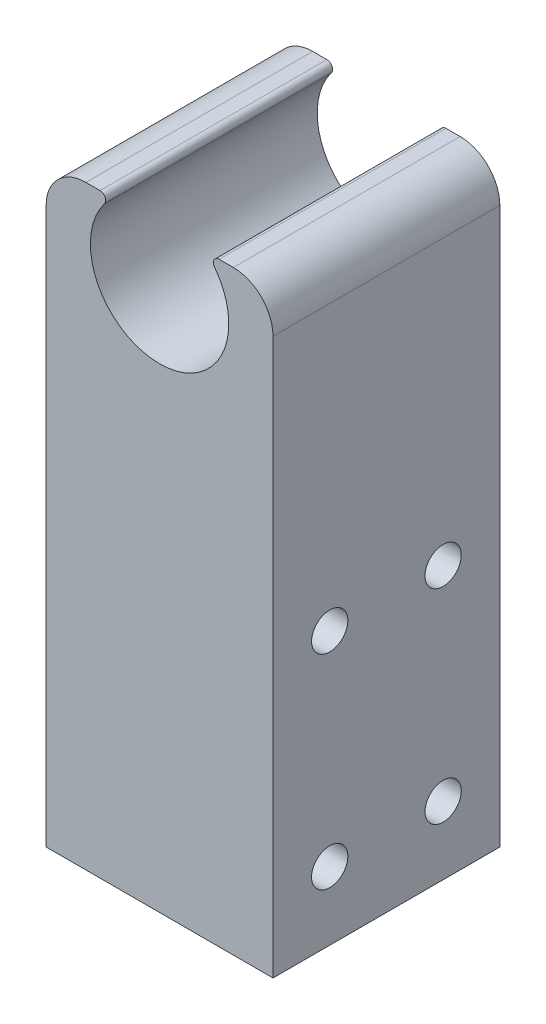
ISO-10303-21;
HEADER;
FILE_DESCRIPTION(('STEP AP214'),'2;1');
FILE_NAME('part.step','',(''),(''),'','','');
FILE_SCHEMA(('AUTOMOTIVE_DESIGN { 1 0 10303 214 1 1 1 1 }'));
ENDSEC;
DATA;
#1=APPLICATION_CONTEXT('core data for automotive mechanical design processes');
#2=APPLICATION_PROTOCOL_DEFINITION('international standard','automotive_design',2000,#1);
#3=PRODUCT_CONTEXT('',#1,'mechanical');
#4=PRODUCT('Part','Part','',(#3));
#5=PRODUCT_RELATED_PRODUCT_CATEGORY('part','',(#4));
#6=PRODUCT_DEFINITION_FORMATION('','',#4);
#7=PRODUCT_DEFINITION_CONTEXT('part definition',#1,'design');
#8=PRODUCT_DEFINITION('design','',#6,#7);
#9=PRODUCT_DEFINITION_SHAPE('','',#8);
#10=(LENGTH_UNIT() NAMED_UNIT(*) SI_UNIT(.MILLI.,.METRE.));
#11=(NAMED_UNIT(*) PLANE_ANGLE_UNIT() SI_UNIT($,.RADIAN.));
#12=(NAMED_UNIT(*) SI_UNIT($,.STERADIAN.) SOLID_ANGLE_UNIT());
#13=UNCERTAINTY_MEASURE_WITH_UNIT(LENGTH_MEASURE(1.E-05),#10,'distance_accuracy_value','');
#14=(GEOMETRIC_REPRESENTATION_CONTEXT(3) GLOBAL_UNCERTAINTY_ASSIGNED_CONTEXT((#13)) GLOBAL_UNIT_ASSIGNED_CONTEXT((#10,
#11,#12)) REPRESENTATION_CONTEXT('',''));
#15=CARTESIAN_POINT('',(0.,0.,0.));
#16=DIRECTION('',(0.,0.,1.));
#17=DIRECTION('',(1.,0.,0.));
#18=AXIS2_PLACEMENT_3D('',#15,#16,#17);
#19=CARTESIAN_POINT('',(0.,0.,20.));
#20=DIRECTION('',(0.,1.,0.));
#21=DIRECTION('',(0.,0.,1.));
#22=AXIS2_PLACEMENT_3D('',#19,#20,#21);
#23=PLANE('',#22);
#24=DIRECTION('',(1.,0.,0.));
#25=VECTOR('',#24,1.);
#26=CARTESIAN_POINT('',(0.,0.,0.));
#27=LINE('',#26,#25);
#28=CARTESIAN_POINT('',(0.,0.,0.));
#29=VERTEX_POINT('',#28);
#30=CARTESIAN_POINT('',(20.,0.,0.));
#31=VERTEX_POINT('',#30);
#32=EDGE_CURVE('E197',#29,#31,#27,.T.);
#33=ORIENTED_EDGE('',*,*,#32,.T.);
#34=DIRECTION('',(0.,0.,-1.));
#35=VECTOR('',#34,1.);
#36=CARTESIAN_POINT('',(20.,0.,20.));
#37=LINE('',#36,#35);
#38=CARTESIAN_POINT('',(20.,0.,20.));
#39=VERTEX_POINT('',#38);
#40=EDGE_CURVE('E132',#39,#31,#37,.T.);
#41=ORIENTED_EDGE('',*,*,#40,.F.);
#42=DIRECTION('',(1.,0.,0.));
#43=VECTOR('',#42,1.);
#44=CARTESIAN_POINT('',(0.,0.,20.));
#45=LINE('',#44,#43);
#46=CARTESIAN_POINT('',(0.,0.,20.));
#47=VERTEX_POINT('',#46);
#48=EDGE_CURVE('E117',#47,#39,#45,.T.);
#49=ORIENTED_EDGE('',*,*,#48,.F.);
#50=DIRECTION('',(0.,0.,-1.));
#51=VECTOR('',#50,1.);
#52=CARTESIAN_POINT('',(0.,0.,20.));
#53=LINE('',#52,#51);
#54=EDGE_CURVE('E130',#47,#29,#53,.T.);
#55=ORIENTED_EDGE('',*,*,#54,.T.);
#56=EDGE_LOOP('',(#33,#41,#49,#55));
#57=FACE_BOUND('',#56,.T.);
#58=ADVANCED_FACE('F35',(#57),#23,.F.);
#59=CARTESIAN_POINT('',(20.,30.,20.));
#60=DIRECTION('',(-1.,0.,0.));
#61=DIRECTION('',(0.,0.,1.));
#62=AXIS2_PLACEMENT_3D('',#59,#60,#61);
#63=PLANE('',#62);
#64=CARTESIAN_POINT('',(20.,24.,5.));
#65=DIRECTION('',(1.,0.,0.));
#66=DIRECTION('',(0.,0.,1.));
#67=AXIS2_PLACEMENT_3D('',#64,#65,#66);
#68=CIRCLE('',#67,1.6);
#69=CARTESIAN_POINT('',(20.,24.,6.6));
#70=VERTEX_POINT('',#69);
#71=EDGE_CURVE('E277',#70,#70,#68,.T.);
#72=ORIENTED_EDGE('',*,*,#71,.F.);
#73=EDGE_LOOP('',(#72));
#74=FACE_BOUND('',#73,.T.);
#75=CARTESIAN_POINT('',(20.,6.,5.));
#76=DIRECTION('',(1.,0.,0.));
#77=DIRECTION('',(0.,0.,-1.));
#78=AXIS2_PLACEMENT_3D('',#75,#76,#77);
#79=CIRCLE('',#78,1.6);
#80=CARTESIAN_POINT('',(20.,6.,3.4));
#81=VERTEX_POINT('',#80);
#82=EDGE_CURVE('E269',#81,#81,#79,.T.);
#83=ORIENTED_EDGE('',*,*,#82,.F.);
#84=EDGE_LOOP('',(#83));
#85=FACE_BOUND('',#84,.T.);
#86=CARTESIAN_POINT('',(20.,6.,15.));
#87=DIRECTION('',(1.,0.,0.));
#88=DIRECTION('',(0.,0.,1.));
#89=AXIS2_PLACEMENT_3D('',#86,#87,#88);
#90=CIRCLE('',#89,1.6);
#91=CARTESIAN_POINT('',(20.,6.,16.6));
#92=VERTEX_POINT('',#91);
#93=EDGE_CURVE('E262',#92,#92,#90,.T.);
#94=ORIENTED_EDGE('',*,*,#93,.F.);
#95=EDGE_LOOP('',(#94));
#96=FACE_BOUND('',#95,.T.);
#97=CARTESIAN_POINT('',(20.,24.,15.));
#98=DIRECTION('',(1.,0.,0.));
#99=DIRECTION('',(0.,0.,-1.));
#100=AXIS2_PLACEMENT_3D('',#97,#98,#99);
#101=CIRCLE('',#100,1.6);
#102=CARTESIAN_POINT('',(20.,24.,13.4));
#103=VERTEX_POINT('',#102);
#104=EDGE_CURVE('E266',#103,#103,#101,.T.);
#105=ORIENTED_EDGE('',*,*,#104,.F.);
#106=EDGE_LOOP('',(#105));
#107=FACE_BOUND('',#106,.T.);
#108=DIRECTION('',(0.,1.,0.));
#109=VECTOR('',#108,1.);
#110=CARTESIAN_POINT('',(20.,30.,0.));
#111=LINE('',#110,#109);
#112=CARTESIAN_POINT('',(20.,49.,0.));
#113=VERTEX_POINT('',#112);
#114=EDGE_CURVE('E192',#31,#113,#111,.T.);
#115=ORIENTED_EDGE('',*,*,#114,.T.);
#116=DIRECTION('',(0.,0.,-1.));
#117=VECTOR('',#116,1.);
#118=CARTESIAN_POINT('',(20.,49.,20.));
#119=LINE('',#118,#117);
#120=CARTESIAN_POINT('',(20.,49.,20.));
#121=VERTEX_POINT('',#120);
#122=EDGE_CURVE('E152',#113,#121,#119,.F.);
#123=ORIENTED_EDGE('',*,*,#122,.T.);
#124=DIRECTION('',(0.,1.,0.));
#125=VECTOR('',#124,1.);
#126=CARTESIAN_POINT('',(20.,0.,20.));
#127=LINE('',#126,#125);
#128=EDGE_CURVE('E134',#39,#121,#127,.T.);
#129=ORIENTED_EDGE('',*,*,#128,.F.);
#130=ORIENTED_EDGE('',*,*,#40,.T.);
#131=EDGE_LOOP('',(#115,#123,#129,#130));
#132=FACE_BOUND('',#131,.T.);
#133=ADVANCED_FACE('F219',(#74,#85,#96,#107,#132),#63,.F.);
#134=CARTESIAN_POINT('',(20.,52.5,20.));
#135=DIRECTION('',(0.,-1.,0.));
#136=DIRECTION('',(1.,0.,0.));
#137=AXIS2_PLACEMENT_3D('',#134,#135,#136);
#138=PLANE('',#137);
#139=DIRECTION('',(-1.,0.,0.));
#140=VECTOR('',#139,1.);
#141=CARTESIAN_POINT('',(20.,52.5,0.));
#142=LINE('',#141,#140);
#143=CARTESIAN_POINT('',(16.5,52.5,0.));
#144=VERTEX_POINT('',#143);
#145=CARTESIAN_POINT('',(15.2497618993627,52.5,0.));
#146=VERTEX_POINT('',#145);
#147=EDGE_CURVE('E188',#144,#146,#142,.T.);
#148=ORIENTED_EDGE('',*,*,#147,.T.);
#149=DIRECTION('',(0.,0.,-1.));
#150=VECTOR('',#149,1.);
#151=CARTESIAN_POINT('',(15.2497618993627,52.5,20.));
#152=LINE('',#151,#150);
#153=CARTESIAN_POINT('',(15.2497618993627,52.5,20.));
#154=VERTEX_POINT('',#153);
#155=EDGE_CURVE('E58',#146,#154,#152,.F.);
#156=ORIENTED_EDGE('',*,*,#155,.T.);
#157=DIRECTION('',(-1.,0.,0.));
#158=VECTOR('',#157,1.);
#159=CARTESIAN_POINT('',(20.,52.5,20.));
#160=LINE('',#159,#158);
#161=CARTESIAN_POINT('',(16.5,52.5,20.));
#162=VERTEX_POINT('',#161);
#163=EDGE_CURVE('E175',#162,#154,#160,.T.);
#164=ORIENTED_EDGE('',*,*,#163,.F.);
#165=DIRECTION('',(0.,0.,-1.));
#166=VECTOR('',#165,1.);
#167=CARTESIAN_POINT('',(16.5,52.5,20.));
#168=LINE('',#167,#166);
#169=EDGE_CURVE('E139',#162,#144,#168,.T.);
#170=ORIENTED_EDGE('',*,*,#169,.T.);
#171=EDGE_LOOP('',(#148,#156,#164,#170));
#172=FACE_BOUND('',#171,.T.);
#173=ADVANCED_FACE('F190',(#172),#138,.F.);
#174=CARTESIAN_POINT('',(10.,48.,20.));
#175=DIRECTION('',(0.,0.,-1.));
#176=DIRECTION('',(-1.,0.,0.));
#177=AXIS2_PLACEMENT_3D('',#174,#175,#176);
#178=CYLINDRICAL_SURFACE('',#177,6.1);
#179=CARTESIAN_POINT('',(10.,48.,20.));
#180=DIRECTION('',(0.,0.,-1.));
#181=DIRECTION('',(1.,0.,0.));
#182=AXIS2_PLACEMENT_3D('',#179,#180,#181);
#183=CIRCLE('',#182,6.1);
#184=CARTESIAN_POINT('',(14.8520526645625,51.6969696969697,20.));
#185=VERTEX_POINT('',#184);
#186=CARTESIAN_POINT('',(5.14794733543752,51.6969696969697,20.));
#187=VERTEX_POINT('',#186);
#188=EDGE_CURVE('E174',#185,#187,#183,.T.);
#189=ORIENTED_EDGE('',*,*,#188,.F.);
#190=DIRECTION('',(0.,0.,-1.));
#191=VECTOR('',#190,1.);
#192=CARTESIAN_POINT('',(14.8520526645625,51.6969696969697,20.));
#193=LINE('',#192,#191);
#194=CARTESIAN_POINT('',(14.8520526645625,51.6969696969697,0.));
#195=VERTEX_POINT('',#194);
#196=EDGE_CURVE('E164',#185,#195,#193,.T.);
#197=ORIENTED_EDGE('',*,*,#196,.T.);
#198=CARTESIAN_POINT('',(10.,48.,0.));
#199=DIRECTION('',(0.,0.,-1.));
#200=DIRECTION('',(1.,0.,0.));
#201=AXIS2_PLACEMENT_3D('',#198,#199,#200);
#202=CIRCLE('',#201,6.1);
#203=CARTESIAN_POINT('',(5.14794733543752,51.6969696969697,0.));
#204=VERTEX_POINT('',#203);
#205=EDGE_CURVE('E189',#195,#204,#202,.T.);
#206=ORIENTED_EDGE('',*,*,#205,.T.);
#207=DIRECTION('',(0.,0.,-1.));
#208=VECTOR('',#207,1.);
#209=CARTESIAN_POINT('',(5.14794733543752,51.6969696969697,20.));
#210=LINE('',#209,#208);
#211=EDGE_CURVE('E162',#204,#187,#210,.F.);
#212=ORIENTED_EDGE('',*,*,#211,.T.);
#213=EDGE_LOOP('',(#189,#197,#206,#212));
#214=FACE_BOUND('',#213,.T.);
#215=ADVANCED_FACE('F179',(#214),#178,.F.);
#216=CARTESIAN_POINT('',(0.,52.5,20.));
#217=DIRECTION('',(0.,-1.,0.));
#218=DIRECTION('',(1.,0.,0.));
#219=AXIS2_PLACEMENT_3D('',#216,#217,#218);
#220=PLANE('',#219);
#221=DIRECTION('',(-1.,0.,0.));
#222=VECTOR('',#221,1.);
#223=CARTESIAN_POINT('',(0.,52.5,20.));
#224=LINE('',#223,#222);
#225=CARTESIAN_POINT('',(4.75023810063732,52.5,20.));
#226=VERTEX_POINT('',#225);
#227=CARTESIAN_POINT('',(3.5,52.5,20.));
#228=VERTEX_POINT('',#227);
#229=EDGE_CURVE('E144',#226,#228,#224,.T.);
#230=ORIENTED_EDGE('',*,*,#229,.F.);
#231=DIRECTION('',(0.,0.,-1.));
#232=VECTOR('',#231,1.);
#233=CARTESIAN_POINT('',(4.75023810063732,52.5,20.));
#234=LINE('',#233,#232);
#235=CARTESIAN_POINT('',(4.75023810063732,52.5,0.));
#236=VERTEX_POINT('',#235);
#237=EDGE_CURVE('E11',#226,#236,#234,.T.);
#238=ORIENTED_EDGE('',*,*,#237,.T.);
#239=DIRECTION('',(-1.,0.,0.));
#240=VECTOR('',#239,1.);
#241=CARTESIAN_POINT('',(0.,52.5,0.));
#242=LINE('',#241,#240);
#243=CARTESIAN_POINT('',(3.5,52.5,0.));
#244=VERTEX_POINT('',#243);
#245=EDGE_CURVE('E194',#236,#244,#242,.T.);
#246=ORIENTED_EDGE('',*,*,#245,.T.);
#247=DIRECTION('',(0.,0.,-1.));
#248=VECTOR('',#247,1.);
#249=CARTESIAN_POINT('',(3.5,52.5,20.));
#250=LINE('',#249,#248);
#251=EDGE_CURVE('E159',#244,#228,#250,.F.);
#252=ORIENTED_EDGE('',*,*,#251,.T.);
#253=EDGE_LOOP('',(#230,#238,#246,#252));
#254=FACE_BOUND('',#253,.T.);
#255=ADVANCED_FACE('F203',(#254),#220,.F.);
#256=CARTESIAN_POINT('',(0.,30.,20.));
#257=DIRECTION('',(1.,0.,0.));
#258=DIRECTION('',(0.,0.,-1.));
#259=AXIS2_PLACEMENT_3D('',#256,#257,#258);
#260=PLANE('',#259);
#261=CARTESIAN_POINT('',(0.,24.,5.));
#262=DIRECTION('',(1.,0.,0.));
#263=DIRECTION('',(0.,0.,1.));
#264=AXIS2_PLACEMENT_3D('',#261,#262,#263);
#265=CIRCLE('',#264,1.6);
#266=CARTESIAN_POINT('',(0.,24.,6.6));
#267=VERTEX_POINT('',#266);
#268=EDGE_CURVE('E274',#267,#267,#265,.T.);
#269=ORIENTED_EDGE('',*,*,#268,.T.);
#270=EDGE_LOOP('',(#269));
#271=FACE_BOUND('',#270,.T.);
#272=CARTESIAN_POINT('',(0.,6.,5.));
#273=DIRECTION('',(1.,0.,0.));
#274=DIRECTION('',(0.,0.,-1.));
#275=AXIS2_PLACEMENT_3D('',#272,#273,#274);
#276=CIRCLE('',#275,1.6);
#277=CARTESIAN_POINT('',(0.,6.,3.4));
#278=VERTEX_POINT('',#277);
#279=EDGE_CURVE('E264',#278,#278,#276,.T.);
#280=ORIENTED_EDGE('',*,*,#279,.T.);
#281=EDGE_LOOP('',(#280));
#282=FACE_BOUND('',#281,.T.);
#283=CARTESIAN_POINT('',(0.,6.,15.));
#284=DIRECTION('',(1.,0.,0.));
#285=DIRECTION('',(0.,0.,1.));
#286=AXIS2_PLACEMENT_3D('',#283,#284,#285);
#287=CIRCLE('',#286,1.6);
#288=CARTESIAN_POINT('',(0.,6.,16.6));
#289=VERTEX_POINT('',#288);
#290=EDGE_CURVE('E259',#289,#289,#287,.T.);
#291=ORIENTED_EDGE('',*,*,#290,.T.);
#292=EDGE_LOOP('',(#291));
#293=FACE_BOUND('',#292,.T.);
#294=CARTESIAN_POINT('',(0.,24.,15.));
#295=DIRECTION('',(1.,0.,0.));
#296=DIRECTION('',(0.,0.,-1.));
#297=AXIS2_PLACEMENT_3D('',#294,#295,#296);
#298=CIRCLE('',#297,1.6);
#299=CARTESIAN_POINT('',(0.,24.,13.4));
#300=VERTEX_POINT('',#299);
#301=EDGE_CURVE('E280',#300,#300,#298,.T.);
#302=ORIENTED_EDGE('',*,*,#301,.T.);
#303=EDGE_LOOP('',(#302));
#304=FACE_BOUND('',#303,.T.);
#305=DIRECTION('',(0.,-1.,0.));
#306=VECTOR('',#305,1.);
#307=CARTESIAN_POINT('',(0.,0.,20.));
#308=LINE('',#307,#306);
#309=CARTESIAN_POINT('',(0.,49.,20.));
#310=VERTEX_POINT('',#309);
#311=EDGE_CURVE('E113',#310,#47,#308,.T.);
#312=ORIENTED_EDGE('',*,*,#311,.F.);
#313=DIRECTION('',(0.,0.,-1.));
#314=VECTOR('',#313,1.);
#315=CARTESIAN_POINT('',(0.,49.,20.));
#316=LINE('',#315,#314);
#317=CARTESIAN_POINT('',(0.,49.,0.));
#318=VERTEX_POINT('',#317);
#319=EDGE_CURVE('E157',#310,#318,#316,.T.);
#320=ORIENTED_EDGE('',*,*,#319,.T.);
#321=DIRECTION('',(0.,-1.,0.));
#322=VECTOR('',#321,1.);
#323=CARTESIAN_POINT('',(0.,30.,0.));
#324=LINE('',#323,#322);
#325=EDGE_CURVE('E125',#318,#29,#324,.T.);
#326=ORIENTED_EDGE('',*,*,#325,.T.);
#327=ORIENTED_EDGE('',*,*,#54,.F.);
#328=EDGE_LOOP('',(#312,#320,#326,#327));
#329=FACE_BOUND('',#328,.T.);
#330=ADVANCED_FACE('F136',(#271,#282,#293,#304,#329),#260,.F.);
#331=CARTESIAN_POINT('',(10.,48.,20.));
#332=DIRECTION('',(0.,0.,1.));
#333=DIRECTION('',(1.,0.,0.));
#334=AXIS2_PLACEMENT_3D('',#331,#332,#333);
#335=PLANE('',#334);
#336=ORIENTED_EDGE('',*,*,#163,.T.);
#337=CARTESIAN_POINT('',(15.2497618993627,52.,20.));
#338=DIRECTION('',(0.,0.,1.));
#339=DIRECTION('',(1.,0.,0.));
#340=AXIS2_PLACEMENT_3D('',#337,#338,#339);
#341=CIRCLE('',#340,0.5);
#342=EDGE_CURVE('E43',#154,#185,#341,.T.);
#343=ORIENTED_EDGE('',*,*,#342,.T.);
#344=ORIENTED_EDGE('',*,*,#188,.T.);
#345=CARTESIAN_POINT('',(4.75023810063732,52.,20.));
#346=DIRECTION('',(0.,0.,1.));
#347=DIRECTION('',(1.,0.,0.));
#348=AXIS2_PLACEMENT_3D('',#345,#346,#347);
#349=CIRCLE('',#348,0.5);
#350=EDGE_CURVE('E50',#187,#226,#349,.T.);
#351=ORIENTED_EDGE('',*,*,#350,.T.);
#352=ORIENTED_EDGE('',*,*,#229,.T.);
#353=CARTESIAN_POINT('',(3.5,49.,20.));
#354=DIRECTION('',(0.,0.,1.));
#355=DIRECTION('',(1.,0.,0.));
#356=AXIS2_PLACEMENT_3D('',#353,#354,#355);
#357=CIRCLE('',#356,3.5);
#358=EDGE_CURVE('E120',#228,#310,#357,.T.);
#359=ORIENTED_EDGE('',*,*,#358,.T.);
#360=ORIENTED_EDGE('',*,*,#311,.T.);
#361=ORIENTED_EDGE('',*,*,#48,.T.);
#362=ORIENTED_EDGE('',*,*,#128,.T.);
#363=CARTESIAN_POINT('',(16.5,49.,20.));
#364=DIRECTION('',(0.,0.,1.));
#365=DIRECTION('',(1.,0.,0.));
#366=AXIS2_PLACEMENT_3D('',#363,#364,#365);
#367=CIRCLE('',#366,3.5);
#368=EDGE_CURVE('E155',#121,#162,#367,.T.);
#369=ORIENTED_EDGE('',*,*,#368,.T.);
#370=EDGE_LOOP('',(#336,#343,#344,#351,#352,#359,#360,#361,#362,#369));
#371=FACE_BOUND('',#370,.T.);
#372=ADVANCED_FACE('F115',(#371),#335,.T.);
#373=CARTESIAN_POINT('',(10.,48.,0.));
#374=DIRECTION('',(0.,0.,1.));
#375=DIRECTION('',(1.,0.,0.));
#376=AXIS2_PLACEMENT_3D('',#373,#374,#375);
#377=PLANE('',#376);
#378=ORIENTED_EDGE('',*,*,#205,.F.);
#379=CARTESIAN_POINT('',(15.2497618993627,52.,0.));
#380=DIRECTION('',(0.,0.,1.));
#381=DIRECTION('',(1.,0.,0.));
#382=AXIS2_PLACEMENT_3D('',#379,#380,#381);
#383=CIRCLE('',#382,0.5);
#384=EDGE_CURVE('E169',#195,#146,#383,.F.);
#385=ORIENTED_EDGE('',*,*,#384,.T.);
#386=ORIENTED_EDGE('',*,*,#147,.F.);
#387=CARTESIAN_POINT('',(16.5,49.,0.));
#388=DIRECTION('',(0.,0.,1.));
#389=DIRECTION('',(1.,0.,0.));
#390=AXIS2_PLACEMENT_3D('',#387,#388,#389);
#391=CIRCLE('',#390,3.5);
#392=EDGE_CURVE('E150',#144,#113,#391,.F.);
#393=ORIENTED_EDGE('',*,*,#392,.T.);
#394=ORIENTED_EDGE('',*,*,#114,.F.);
#395=ORIENTED_EDGE('',*,*,#32,.F.);
#396=ORIENTED_EDGE('',*,*,#325,.F.);
#397=CARTESIAN_POINT('',(3.5,49.,0.));
#398=DIRECTION('',(0.,0.,1.));
#399=DIRECTION('',(1.,0.,0.));
#400=AXIS2_PLACEMENT_3D('',#397,#398,#399);
#401=CIRCLE('',#400,3.5);
#402=EDGE_CURVE('E142',#318,#244,#401,.F.);
#403=ORIENTED_EDGE('',*,*,#402,.T.);
#404=ORIENTED_EDGE('',*,*,#245,.F.);
#405=CARTESIAN_POINT('',(4.75023810063732,52.,0.));
#406=DIRECTION('',(0.,0.,1.));
#407=DIRECTION('',(1.,0.,0.));
#408=AXIS2_PLACEMENT_3D('',#405,#406,#407);
#409=CIRCLE('',#408,0.5);
#410=EDGE_CURVE('E167',#236,#204,#409,.F.);
#411=ORIENTED_EDGE('',*,*,#410,.T.);
#412=EDGE_LOOP('',(#378,#385,#386,#393,#394,#395,#396,#403,#404,#411));
#413=FACE_BOUND('',#412,.T.);
#414=ADVANCED_FACE('F187',(#413),#377,.F.);
#415=CARTESIAN_POINT('',(0.,24.,15.));
#416=DIRECTION('',(1.,0.,0.));
#417=DIRECTION('',(0.,0.,-1.));
#418=AXIS2_PLACEMENT_3D('',#415,#416,#417);
#419=CYLINDRICAL_SURFACE('',#418,1.6);
#420=ORIENTED_EDGE('',*,*,#301,.F.);
#421=EDGE_LOOP('',(#420));
#422=FACE_BOUND('',#421,.T.);
#423=ORIENTED_EDGE('',*,*,#104,.T.);
#424=EDGE_LOOP('',(#423));
#425=FACE_BOUND('',#424,.T.);
#426=ADVANCED_FACE('F238',(#422,#425),#419,.F.);
#427=CARTESIAN_POINT('',(0.,6.,15.));
#428=DIRECTION('',(1.,0.,0.));
#429=DIRECTION('',(0.,0.,-1.));
#430=AXIS2_PLACEMENT_3D('',#427,#428,#429);
#431=CYLINDRICAL_SURFACE('',#430,1.6);
#432=ORIENTED_EDGE('',*,*,#290,.F.);
#433=EDGE_LOOP('',(#432));
#434=FACE_BOUND('',#433,.T.);
#435=ORIENTED_EDGE('',*,*,#93,.T.);
#436=EDGE_LOOP('',(#435));
#437=FACE_BOUND('',#436,.T.);
#438=ADVANCED_FACE('F243',(#434,#437),#431,.F.);
#439=CARTESIAN_POINT('',(0.,6.,5.));
#440=DIRECTION('',(1.,0.,0.));
#441=DIRECTION('',(0.,0.,-1.));
#442=AXIS2_PLACEMENT_3D('',#439,#440,#441);
#443=CYLINDRICAL_SURFACE('',#442,1.6);
#444=ORIENTED_EDGE('',*,*,#279,.F.);
#445=EDGE_LOOP('',(#444));
#446=FACE_BOUND('',#445,.T.);
#447=ORIENTED_EDGE('',*,*,#82,.T.);
#448=EDGE_LOOP('',(#447));
#449=FACE_BOUND('',#448,.T.);
#450=ADVANCED_FACE('F247',(#446,#449),#443,.F.);
#451=CARTESIAN_POINT('',(0.,24.,5.));
#452=DIRECTION('',(1.,0.,0.));
#453=DIRECTION('',(0.,0.,-1.));
#454=AXIS2_PLACEMENT_3D('',#451,#452,#453);
#455=CYLINDRICAL_SURFACE('',#454,1.6);
#456=ORIENTED_EDGE('',*,*,#268,.F.);
#457=EDGE_LOOP('',(#456));
#458=FACE_BOUND('',#457,.T.);
#459=ORIENTED_EDGE('',*,*,#71,.T.);
#460=EDGE_LOOP('',(#459));
#461=FACE_BOUND('',#460,.T.);
#462=ADVANCED_FACE('F215',(#458,#461),#455,.F.);
#463=CARTESIAN_POINT('',(16.5,49.,20.));
#464=DIRECTION('',(0.,0.,-1.));
#465=DIRECTION('',(-1.,0.,0.));
#466=AXIS2_PLACEMENT_3D('',#463,#464,#465);
#467=CYLINDRICAL_SURFACE('',#466,3.5);
#468=ORIENTED_EDGE('',*,*,#368,.F.);
#469=ORIENTED_EDGE('',*,*,#122,.F.);
#470=ORIENTED_EDGE('',*,*,#392,.F.);
#471=ORIENTED_EDGE('',*,*,#169,.F.);
#472=EDGE_LOOP('',(#468,#469,#470,#471));
#473=FACE_BOUND('',#472,.T.);
#474=ADVANCED_FACE('F209',(#473),#467,.T.);
#475=CARTESIAN_POINT('',(3.5,49.,20.));
#476=DIRECTION('',(0.,0.,-1.));
#477=DIRECTION('',(-1.,0.,0.));
#478=AXIS2_PLACEMENT_3D('',#475,#476,#477);
#479=CYLINDRICAL_SURFACE('',#478,3.5);
#480=ORIENTED_EDGE('',*,*,#358,.F.);
#481=ORIENTED_EDGE('',*,*,#251,.F.);
#482=ORIENTED_EDGE('',*,*,#402,.F.);
#483=ORIENTED_EDGE('',*,*,#319,.F.);
#484=EDGE_LOOP('',(#480,#481,#482,#483));
#485=FACE_BOUND('',#484,.T.);
#486=ADVANCED_FACE('F207',(#485),#479,.T.);
#487=CARTESIAN_POINT('',(15.2497618993627,52.,20.));
#488=DIRECTION('',(0.,0.,-1.));
#489=DIRECTION('',(-1.,0.,0.));
#490=AXIS2_PLACEMENT_3D('',#487,#488,#489);
#491=CYLINDRICAL_SURFACE('',#490,0.5);
#492=ORIENTED_EDGE('',*,*,#342,.F.);
#493=ORIENTED_EDGE('',*,*,#155,.F.);
#494=ORIENTED_EDGE('',*,*,#384,.F.);
#495=ORIENTED_EDGE('',*,*,#196,.F.);
#496=EDGE_LOOP('',(#492,#493,#494,#495));
#497=FACE_BOUND('',#496,.T.);
#498=ADVANCED_FACE('F184',(#497),#491,.T.);
#499=CARTESIAN_POINT('',(4.75023810063732,52.,20.));
#500=DIRECTION('',(0.,0.,-1.));
#501=DIRECTION('',(-1.,0.,0.));
#502=AXIS2_PLACEMENT_3D('',#499,#500,#501);
#503=CYLINDRICAL_SURFACE('',#502,0.5);
#504=ORIENTED_EDGE('',*,*,#350,.F.);
#505=ORIENTED_EDGE('',*,*,#211,.F.);
#506=ORIENTED_EDGE('',*,*,#410,.F.);
#507=ORIENTED_EDGE('',*,*,#237,.F.);
#508=EDGE_LOOP('',(#504,#505,#506,#507));
#509=FACE_BOUND('',#508,.T.);
#510=ADVANCED_FACE('F37',(#509),#503,.T.);
#511=CLOSED_SHELL('',(#58,#133,#173,#215,#255,#330,#372,#414,#426,#438,#450,#462,#474,#486,#498,#510));
#512=MANIFOLD_SOLID_BREP('B2',#511);
#513=ADVANCED_BREP_SHAPE_REPRESENTATION('',(#18,#512),#14);
#514=SHAPE_DEFINITION_REPRESENTATION(#9,#513);
ENDSEC;
END-ISO-10303-21;
